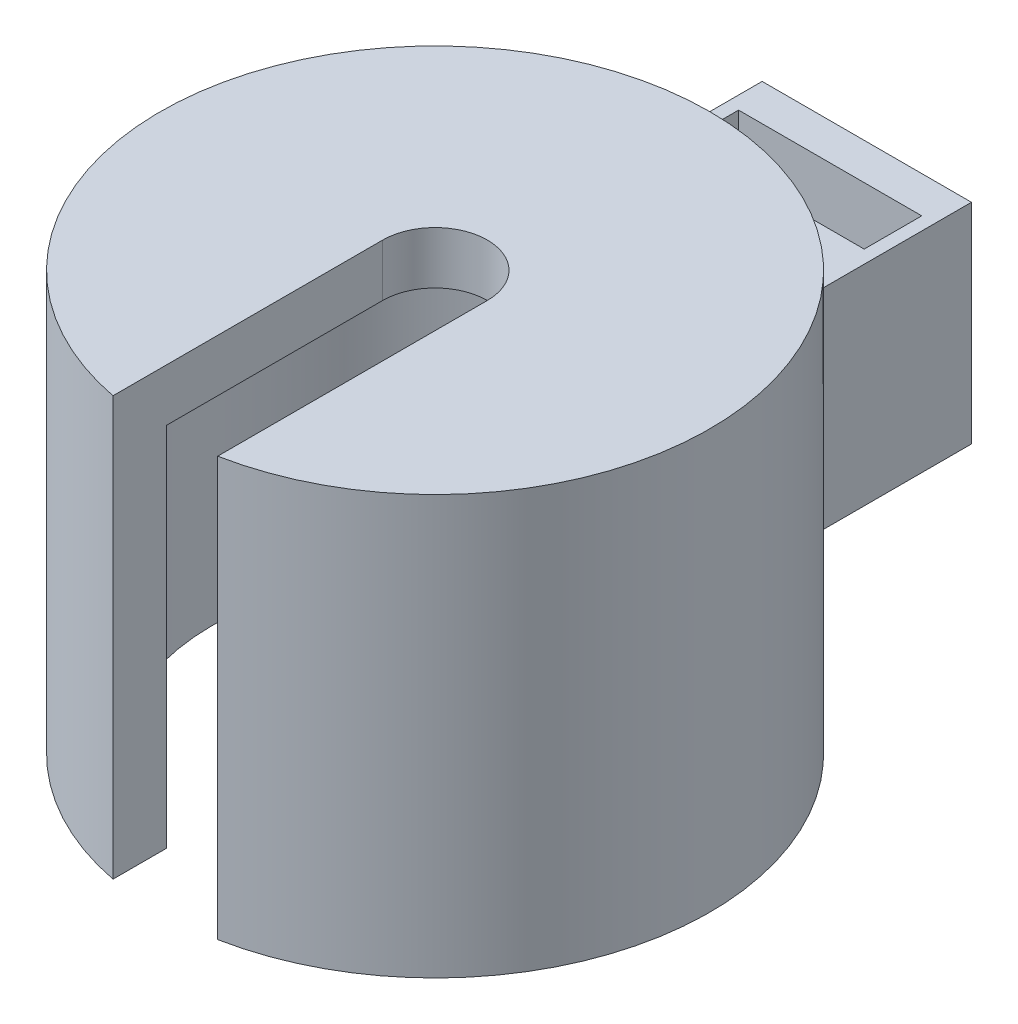
ISO-10303-21;
HEADER;
FILE_DESCRIPTION(('STEP AP214'),'2;1');
FILE_NAME('part.step','',(''),(''),'','','');
FILE_SCHEMA(('AUTOMOTIVE_DESIGN { 1 0 10303 214 1 1 1 1 }'));
ENDSEC;
DATA;
#1=APPLICATION_CONTEXT('core data for automotive mechanical design processes');
#2=APPLICATION_PROTOCOL_DEFINITION('international standard','automotive_design',2000,#1);
#3=PRODUCT_CONTEXT('',#1,'mechanical');
#4=PRODUCT('Part','Part','',(#3));
#5=PRODUCT_RELATED_PRODUCT_CATEGORY('part','',(#4));
#6=PRODUCT_DEFINITION_FORMATION('','',#4);
#7=PRODUCT_DEFINITION_CONTEXT('part definition',#1,'design');
#8=PRODUCT_DEFINITION('design','',#6,#7);
#9=PRODUCT_DEFINITION_SHAPE('','',#8);
#10=(LENGTH_UNIT() NAMED_UNIT(*) SI_UNIT(.MILLI.,.METRE.));
#11=(NAMED_UNIT(*) PLANE_ANGLE_UNIT() SI_UNIT($,.RADIAN.));
#12=(NAMED_UNIT(*) SI_UNIT($,.STERADIAN.) SOLID_ANGLE_UNIT());
#13=UNCERTAINTY_MEASURE_WITH_UNIT(LENGTH_MEASURE(1.E-05),#10,'distance_accuracy_value','');
#14=(GEOMETRIC_REPRESENTATION_CONTEXT(3) GLOBAL_UNCERTAINTY_ASSIGNED_CONTEXT((#13)) GLOBAL_UNIT_ASSIGNED_CONTEXT((#10,
#11,#12)) REPRESENTATION_CONTEXT('',''));
#15=CARTESIAN_POINT('',(0.,0.,0.));
#16=DIRECTION('',(0.,0.,1.));
#17=DIRECTION('',(1.,0.,0.));
#18=AXIS2_PLACEMENT_3D('',#15,#16,#17);
#19=CARTESIAN_POINT('',(0.,7.,0.));
#20=DIRECTION('',(0.,-1.,0.));
#21=DIRECTION('',(0.,0.,-1.));
#22=AXIS2_PLACEMENT_3D('',#19,#20,#21);
#23=CYLINDRICAL_SURFACE('',#22,5.25);
#24=CARTESIAN_POINT('',(0.,0.,0.));
#25=DIRECTION('',(0.,1.,0.));
#26=DIRECTION('',(0.,0.,1.));
#27=AXIS2_PLACEMENT_3D('',#24,#25,#26);
#28=CIRCLE('',#27,5.25);
#29=CARTESIAN_POINT('',(1.,0.,5.15388203202208));
#30=VERTEX_POINT('',#29);
#31=CARTESIAN_POINT('',(-1.,0.,5.15388203202208));
#32=VERTEX_POINT('',#31);
#33=EDGE_CURVE('E266',#30,#32,#28,.T.);
#34=ORIENTED_EDGE('',*,*,#33,.T.);
#35=DIRECTION('',(0.,-1.,0.));
#36=VECTOR('',#35,1.);
#37=CARTESIAN_POINT('',(-1.,7.,5.15388203202208));
#38=LINE('',#37,#36);
#39=CARTESIAN_POINT('',(-1.,8.,5.15388203202208));
#40=VERTEX_POINT('',#39);
#41=EDGE_CURVE('E282',#40,#32,#38,.T.);
#42=ORIENTED_EDGE('',*,*,#41,.F.);
#43=CARTESIAN_POINT('',(0.,8.,0.));
#44=DIRECTION('',(0.,1.,0.));
#45=DIRECTION('',(0.,0.,1.));
#46=AXIS2_PLACEMENT_3D('',#43,#44,#45);
#47=CIRCLE('',#46,5.25);
#48=CARTESIAN_POINT('',(1.,8.,5.15388203202208));
#49=VERTEX_POINT('',#48);
#50=EDGE_CURVE('E233',#49,#40,#47,.T.);
#51=ORIENTED_EDGE('',*,*,#50,.F.);
#52=DIRECTION('',(0.,-1.,0.));
#53=VECTOR('',#52,1.);
#54=CARTESIAN_POINT('',(1.,7.,5.15388203202208));
#55=LINE('',#54,#53);
#56=EDGE_CURVE('E285',#49,#30,#55,.T.);
#57=ORIENTED_EDGE('',*,*,#56,.T.);
#58=EDGE_LOOP('',(#34,#42,#51,#57));
#59=FACE_BOUND('',#58,.T.);
#60=DIRECTION('',(0.,-1.,0.));
#61=VECTOR('',#60,1.);
#62=CARTESIAN_POINT('',(-2.,7.,-4.8541219597369));
#63=LINE('',#62,#61);
#64=CARTESIAN_POINT('',(-2.,2.,-4.8541219597369));
#65=VERTEX_POINT('',#64);
#66=CARTESIAN_POINT('',(-2.,6.,-4.8541219597369));
#67=VERTEX_POINT('',#66);
#68=EDGE_CURVE('E11',#65,#67,#63,.F.);
#69=ORIENTED_EDGE('',*,*,#68,.F.);
#70=CARTESIAN_POINT('',(0.,2.,0.));
#71=DIRECTION('',(0.,-1.,0.));
#72=DIRECTION('',(0.,0.,-1.));
#73=AXIS2_PLACEMENT_3D('',#70,#71,#72);
#74=CIRCLE('',#73,5.25);
#75=CARTESIAN_POINT('',(2.,2.,-4.8541219597369));
#76=VERTEX_POINT('',#75);
#77=EDGE_CURVE('E219',#65,#76,#74,.T.);
#78=ORIENTED_EDGE('',*,*,#77,.T.);
#79=DIRECTION('',(0.,-1.,0.));
#80=VECTOR('',#79,1.);
#81=CARTESIAN_POINT('',(2.,7.,-4.8541219597369));
#82=LINE('',#81,#80);
#83=CARTESIAN_POINT('',(2.,6.,-4.8541219597369));
#84=VERTEX_POINT('',#83);
#85=EDGE_CURVE('E48',#76,#84,#82,.F.);
#86=ORIENTED_EDGE('',*,*,#85,.T.);
#87=CARTESIAN_POINT('',(0.,6.,0.));
#88=DIRECTION('',(0.,-1.,0.));
#89=DIRECTION('',(0.,0.,-1.));
#90=AXIS2_PLACEMENT_3D('',#87,#88,#89);
#91=CIRCLE('',#90,5.25);
#92=EDGE_CURVE('E212',#67,#84,#91,.T.);
#93=ORIENTED_EDGE('',*,*,#92,.F.);
#94=EDGE_LOOP('',(#69,#78,#86,#93));
#95=FACE_BOUND('',#94,.T.);
#96=ADVANCED_FACE('F39',(#59,#95),#23,.T.);
#97=CARTESIAN_POINT('',(1.,7.,0.));
#98=DIRECTION('',(1.,0.,0.));
#99=DIRECTION('',(0.,0.,-1.));
#100=AXIS2_PLACEMENT_3D('',#97,#98,#99);
#101=PLANE('',#100);
#102=DIRECTION('',(0.,0.,1.));
#103=VECTOR('',#102,1.);
#104=CARTESIAN_POINT('',(1.,0.,0.));
#105=LINE('',#104,#103);
#106=CARTESIAN_POINT('',(1.,0.,4.13067791046458));
#107=VERTEX_POINT('',#106);
#108=EDGE_CURVE('E256',#107,#30,#105,.T.);
#109=ORIENTED_EDGE('',*,*,#108,.T.);
#110=ORIENTED_EDGE('',*,*,#56,.F.);
#111=DIRECTION('',(0.,0.,1.));
#112=VECTOR('',#111,1.);
#113=CARTESIAN_POINT('',(1.,8.,0.));
#114=LINE('',#113,#112);
#115=CARTESIAN_POINT('',(1.,8.,0.));
#116=VERTEX_POINT('',#115);
#117=EDGE_CURVE('E228',#116,#49,#114,.T.);
#118=ORIENTED_EDGE('',*,*,#117,.F.);
#119=DIRECTION('',(0.,-1.,0.));
#120=VECTOR('',#119,1.);
#121=CARTESIAN_POINT('',(1.,8.,0.));
#122=LINE('',#121,#120);
#123=CARTESIAN_POINT('',(1.,7.,0.));
#124=VERTEX_POINT('',#123);
#125=EDGE_CURVE('E253',#116,#124,#122,.T.);
#126=ORIENTED_EDGE('',*,*,#125,.T.);
#127=DIRECTION('',(0.,0.,1.));
#128=VECTOR('',#127,1.);
#129=CARTESIAN_POINT('',(1.,7.,0.));
#130=LINE('',#129,#128);
#131=CARTESIAN_POINT('',(1.,7.,4.13067791046458));
#132=VERTEX_POINT('',#131);
#133=EDGE_CURVE('E245',#124,#132,#130,.T.);
#134=ORIENTED_EDGE('',*,*,#133,.T.);
#135=DIRECTION('',(0.,-1.,0.));
#136=VECTOR('',#135,1.);
#137=CARTESIAN_POINT('',(1.,7.,4.13067791046458));
#138=LINE('',#137,#136);
#139=EDGE_CURVE('E261',#132,#107,#138,.T.);
#140=ORIENTED_EDGE('',*,*,#139,.T.);
#141=EDGE_LOOP('',(#109,#110,#118,#126,#134,#140));
#142=FACE_BOUND('',#141,.T.);
#143=ADVANCED_FACE('F41',(#142),#101,.F.);
#144=CARTESIAN_POINT('',(-1.,7.,0.));
#145=DIRECTION('',(1.,0.,0.));
#146=DIRECTION('',(0.,0.,-1.));
#147=AXIS2_PLACEMENT_3D('',#144,#145,#146);
#148=PLANE('',#147);
#149=DIRECTION('',(0.,0.,1.));
#150=VECTOR('',#149,1.);
#151=CARTESIAN_POINT('',(-1.,0.,0.));
#152=LINE('',#151,#150);
#153=CARTESIAN_POINT('',(-1.,0.,4.13067791046458));
#154=VERTEX_POINT('',#153);
#155=EDGE_CURVE('E270',#154,#32,#152,.T.);
#156=ORIENTED_EDGE('',*,*,#155,.F.);
#157=DIRECTION('',(0.,-1.,0.));
#158=VECTOR('',#157,1.);
#159=CARTESIAN_POINT('',(-1.,7.,4.13067791046458));
#160=LINE('',#159,#158);
#161=CARTESIAN_POINT('',(-1.,7.,4.13067791046458));
#162=VERTEX_POINT('',#161);
#163=EDGE_CURVE('E279',#162,#154,#160,.T.);
#164=ORIENTED_EDGE('',*,*,#163,.F.);
#165=DIRECTION('',(0.,0.,1.));
#166=VECTOR('',#165,1.);
#167=CARTESIAN_POINT('',(-1.,7.,0.));
#168=LINE('',#167,#166);
#169=CARTESIAN_POINT('',(-1.,7.,0.));
#170=VERTEX_POINT('',#169);
#171=EDGE_CURVE('E229',#170,#162,#168,.T.);
#172=ORIENTED_EDGE('',*,*,#171,.F.);
#173=DIRECTION('',(0.,-1.,0.));
#174=VECTOR('',#173,1.);
#175=CARTESIAN_POINT('',(-1.,8.,0.));
#176=LINE('',#175,#174);
#177=CARTESIAN_POINT('',(-1.,8.,0.));
#178=VERTEX_POINT('',#177);
#179=EDGE_CURVE('E241',#178,#170,#176,.T.);
#180=ORIENTED_EDGE('',*,*,#179,.F.);
#181=DIRECTION('',(0.,0.,1.));
#182=VECTOR('',#181,1.);
#183=CARTESIAN_POINT('',(-1.,8.,0.));
#184=LINE('',#183,#182);
#185=EDGE_CURVE('E237',#178,#40,#184,.T.);
#186=ORIENTED_EDGE('',*,*,#185,.T.);
#187=ORIENTED_EDGE('',*,*,#41,.T.);
#188=EDGE_LOOP('',(#156,#164,#172,#180,#186,#187));
#189=FACE_BOUND('',#188,.T.);
#190=ADVANCED_FACE('F325',(#189),#148,.T.);
#191=CARTESIAN_POINT('',(0.,7.,0.));
#192=DIRECTION('',(0.,-1.,0.));
#193=DIRECTION('',(0.,0.,-1.));
#194=AXIS2_PLACEMENT_3D('',#191,#192,#193);
#195=CYLINDRICAL_SURFACE('',#194,4.25);
#196=CARTESIAN_POINT('',(0.,0.,0.));
#197=DIRECTION('',(0.,1.,0.));
#198=DIRECTION('',(0.,0.,1.));
#199=AXIS2_PLACEMENT_3D('',#196,#197,#198);
#200=CIRCLE('',#199,4.25);
#201=EDGE_CURVE('E262',#107,#154,#200,.T.);
#202=ORIENTED_EDGE('',*,*,#201,.F.);
#203=ORIENTED_EDGE('',*,*,#139,.F.);
#204=CARTESIAN_POINT('',(0.,7.,0.));
#205=DIRECTION('',(0.,1.,0.));
#206=DIRECTION('',(0.,0.,1.));
#207=AXIS2_PLACEMENT_3D('',#204,#205,#206);
#208=CIRCLE('',#207,4.25);
#209=EDGE_CURVE('E257',#132,#162,#208,.T.);
#210=ORIENTED_EDGE('',*,*,#209,.T.);
#211=ORIENTED_EDGE('',*,*,#163,.T.);
#212=EDGE_LOOP('',(#202,#203,#210,#211));
#213=FACE_BOUND('',#212,.T.);
#214=ADVANCED_FACE('F330',(#213),#195,.F.);
#215=CARTESIAN_POINT('',(0.,0.,0.));
#216=DIRECTION('',(0.,1.,0.));
#217=DIRECTION('',(0.,0.,1.));
#218=AXIS2_PLACEMENT_3D('',#215,#216,#217);
#219=PLANE('',#218);
#220=ORIENTED_EDGE('',*,*,#108,.F.);
#221=ORIENTED_EDGE('',*,*,#201,.T.);
#222=ORIENTED_EDGE('',*,*,#155,.T.);
#223=ORIENTED_EDGE('',*,*,#33,.F.);
#224=EDGE_LOOP('',(#220,#221,#222,#223));
#225=FACE_BOUND('',#224,.T.);
#226=ADVANCED_FACE('F334',(#225),#219,.F.);
#227=CARTESIAN_POINT('',(0.,7.,0.));
#228=DIRECTION('',(0.,1.,0.));
#229=DIRECTION('',(0.,0.,1.));
#230=AXIS2_PLACEMENT_3D('',#227,#228,#229);
#231=PLANE('',#230);
#232=ORIENTED_EDGE('',*,*,#209,.F.);
#233=ORIENTED_EDGE('',*,*,#133,.F.);
#234=CARTESIAN_POINT('',(0.,7.,0.));
#235=DIRECTION('',(0.,1.,0.));
#236=DIRECTION('',(0.,0.,1.));
#237=AXIS2_PLACEMENT_3D('',#234,#235,#236);
#238=CIRCLE('',#237,1.);
#239=EDGE_CURVE('E223',#124,#170,#238,.T.);
#240=ORIENTED_EDGE('',*,*,#239,.T.);
#241=ORIENTED_EDGE('',*,*,#171,.T.);
#242=EDGE_LOOP('',(#232,#233,#240,#241));
#243=FACE_BOUND('',#242,.T.);
#244=ADVANCED_FACE('F338',(#243),#231,.F.);
#245=CARTESIAN_POINT('',(0.,8.,0.));
#246=DIRECTION('',(0.,-1.,0.));
#247=DIRECTION('',(0.,0.,-1.));
#248=AXIS2_PLACEMENT_3D('',#245,#246,#247);
#249=CYLINDRICAL_SURFACE('',#248,1.);
#250=ORIENTED_EDGE('',*,*,#239,.F.);
#251=ORIENTED_EDGE('',*,*,#125,.F.);
#252=CARTESIAN_POINT('',(0.,8.,0.));
#253=DIRECTION('',(0.,1.,0.));
#254=DIRECTION('',(0.,0.,1.));
#255=AXIS2_PLACEMENT_3D('',#252,#253,#254);
#256=CIRCLE('',#255,1.);
#257=EDGE_CURVE('E224',#116,#178,#256,.T.);
#258=ORIENTED_EDGE('',*,*,#257,.T.);
#259=ORIENTED_EDGE('',*,*,#179,.T.);
#260=EDGE_LOOP('',(#250,#251,#258,#259));
#261=FACE_BOUND('',#260,.T.);
#262=ADVANCED_FACE('F316',(#261),#249,.F.);
#263=CARTESIAN_POINT('',(0.,8.,0.));
#264=DIRECTION('',(0.,1.,0.));
#265=DIRECTION('',(0.,0.,1.));
#266=AXIS2_PLACEMENT_3D('',#263,#264,#265);
#267=PLANE('',#266);
#268=ORIENTED_EDGE('',*,*,#257,.F.);
#269=ORIENTED_EDGE('',*,*,#117,.T.);
#270=ORIENTED_EDGE('',*,*,#50,.T.);
#271=ORIENTED_EDGE('',*,*,#185,.F.);
#272=EDGE_LOOP('',(#268,#269,#270,#271));
#273=FACE_BOUND('',#272,.T.);
#274=ADVANCED_FACE('F309',(#273),#267,.T.);
#275=CARTESIAN_POINT('',(-2.,0.,0.));
#276=DIRECTION('',(1.,0.,0.));
#277=DIRECTION('',(0.,0.,-1.));
#278=AXIS2_PLACEMENT_3D('',#275,#276,#277);
#279=PLANE('',#278);
#280=DIRECTION('',(0.,0.,-1.));
#281=VECTOR('',#280,1.);
#282=CARTESIAN_POINT('',(-2.,2.,0.));
#283=LINE('',#282,#281);
#284=CARTESIAN_POINT('',(-2.,2.,-8.25));
#285=VERTEX_POINT('',#284);
#286=EDGE_CURVE('E204',#65,#285,#283,.T.);
#287=ORIENTED_EDGE('',*,*,#286,.F.);
#288=ORIENTED_EDGE('',*,*,#68,.T.);
#289=DIRECTION('',(0.,0.,-1.));
#290=VECTOR('',#289,1.);
#291=CARTESIAN_POINT('',(-2.,6.,0.));
#292=LINE('',#291,#290);
#293=CARTESIAN_POINT('',(-2.,6.,-8.25));
#294=VERTEX_POINT('',#293);
#295=EDGE_CURVE('E201',#67,#294,#292,.T.);
#296=ORIENTED_EDGE('',*,*,#295,.T.);
#297=DIRECTION('',(0.,-1.,0.));
#298=VECTOR('',#297,1.);
#299=CARTESIAN_POINT('',(-2.,0.,-8.25));
#300=LINE('',#299,#298);
#301=EDGE_CURVE('E197',#294,#285,#300,.T.);
#302=ORIENTED_EDGE('',*,*,#301,.T.);
#303=EDGE_LOOP('',(#287,#288,#296,#302));
#304=FACE_BOUND('',#303,.T.);
#305=ADVANCED_FACE('F307',(#304),#279,.F.);
#306=CARTESIAN_POINT('',(2.,0.,0.));
#307=DIRECTION('',(1.,0.,0.));
#308=DIRECTION('',(0.,0.,-1.));
#309=AXIS2_PLACEMENT_3D('',#306,#307,#308);
#310=PLANE('',#309);
#311=ORIENTED_EDGE('',*,*,#85,.F.);
#312=DIRECTION('',(0.,0.,-1.));
#313=VECTOR('',#312,1.);
#314=CARTESIAN_POINT('',(2.,2.,0.));
#315=LINE('',#314,#313);
#316=CARTESIAN_POINT('',(2.,2.,-8.25));
#317=VERTEX_POINT('',#316);
#318=EDGE_CURVE('E194',#76,#317,#315,.T.);
#319=ORIENTED_EDGE('',*,*,#318,.T.);
#320=DIRECTION('',(0.,-1.,0.));
#321=VECTOR('',#320,1.);
#322=CARTESIAN_POINT('',(2.,0.,-8.25));
#323=LINE('',#322,#321);
#324=CARTESIAN_POINT('',(2.,6.,-8.25));
#325=VERTEX_POINT('',#324);
#326=EDGE_CURVE('E187',#325,#317,#323,.T.);
#327=ORIENTED_EDGE('',*,*,#326,.F.);
#328=DIRECTION('',(0.,0.,-1.));
#329=VECTOR('',#328,1.);
#330=CARTESIAN_POINT('',(2.,6.,0.));
#331=LINE('',#330,#329);
#332=EDGE_CURVE('E191',#84,#325,#331,.T.);
#333=ORIENTED_EDGE('',*,*,#332,.F.);
#334=EDGE_LOOP('',(#311,#319,#327,#333));
#335=FACE_BOUND('',#334,.T.);
#336=ADVANCED_FACE('F295',(#335),#310,.T.);
#337=CARTESIAN_POINT('',(-2.,0.,-8.25));
#338=DIRECTION('',(0.,0.,1.));
#339=DIRECTION('',(1.,0.,0.));
#340=AXIS2_PLACEMENT_3D('',#337,#338,#339);
#341=PLANE('',#340);
#342=DIRECTION('',(1.,0.,0.));
#343=VECTOR('',#342,1.);
#344=CARTESIAN_POINT('',(-2.,6.,-8.25));
#345=LINE('',#344,#343);
#346=EDGE_CURVE('E207',#294,#325,#345,.T.);
#347=ORIENTED_EDGE('',*,*,#346,.T.);
#348=ORIENTED_EDGE('',*,*,#326,.T.);
#349=DIRECTION('',(1.,0.,0.));
#350=VECTOR('',#349,1.);
#351=CARTESIAN_POINT('',(-2.,2.,-8.25));
#352=LINE('',#351,#350);
#353=EDGE_CURVE('E208',#285,#317,#352,.T.);
#354=ORIENTED_EDGE('',*,*,#353,.F.);
#355=ORIENTED_EDGE('',*,*,#301,.F.);
#356=EDGE_LOOP('',(#347,#348,#354,#355));
#357=FACE_BOUND('',#356,.T.);
#358=ADVANCED_FACE('F303',(#357),#341,.F.);
#359=CARTESIAN_POINT('',(-2.,2.,0.));
#360=DIRECTION('',(0.,-1.,0.));
#361=DIRECTION('',(0.,0.,-1.));
#362=AXIS2_PLACEMENT_3D('',#359,#360,#361);
#363=PLANE('',#362);
#364=DIRECTION('',(1.,0.,0.));
#365=VECTOR('',#364,1.);
#366=CARTESIAN_POINT('',(-2.,2.,-7.55));
#367=LINE('',#366,#365);
#368=CARTESIAN_POINT('',(-1.75,2.,-7.55));
#369=VERTEX_POINT('',#368);
#370=CARTESIAN_POINT('',(1.75,2.,-7.55));
#371=VERTEX_POINT('',#370);
#372=EDGE_CURVE('E184',#369,#371,#367,.T.);
#373=ORIENTED_EDGE('',*,*,#372,.F.);
#374=DIRECTION('',(0.,0.,-1.));
#375=VECTOR('',#374,1.);
#376=CARTESIAN_POINT('',(-1.75,2.,0.));
#377=LINE('',#376,#375);
#378=CARTESIAN_POINT('',(-1.75,2.,-6.45));
#379=VERTEX_POINT('',#378);
#380=EDGE_CURVE('E171',#379,#369,#377,.T.);
#381=ORIENTED_EDGE('',*,*,#380,.F.);
#382=DIRECTION('',(1.,0.,0.));
#383=VECTOR('',#382,1.);
#384=CARTESIAN_POINT('',(-2.,2.,-6.45));
#385=LINE('',#384,#383);
#386=CARTESIAN_POINT('',(1.75,2.,-6.45));
#387=VERTEX_POINT('',#386);
#388=EDGE_CURVE('E146',#379,#387,#385,.T.);
#389=ORIENTED_EDGE('',*,*,#388,.T.);
#390=DIRECTION('',(0.,0.,-1.));
#391=VECTOR('',#390,1.);
#392=CARTESIAN_POINT('',(1.75,2.,0.));
#393=LINE('',#392,#391);
#394=EDGE_CURVE('E180',#387,#371,#393,.T.);
#395=ORIENTED_EDGE('',*,*,#394,.T.);
#396=EDGE_LOOP('',(#373,#381,#389,#395));
#397=FACE_BOUND('',#396,.T.);
#398=ORIENTED_EDGE('',*,*,#77,.F.);
#399=ORIENTED_EDGE('',*,*,#286,.T.);
#400=ORIENTED_EDGE('',*,*,#353,.T.);
#401=ORIENTED_EDGE('',*,*,#318,.F.);
#402=EDGE_LOOP('',(#398,#399,#400,#401));
#403=FACE_BOUND('',#402,.T.);
#404=ADVANCED_FACE('F298',(#397,#403),#363,.T.);
#405=CARTESIAN_POINT('',(-2.,6.,0.));
#406=DIRECTION('',(0.,-1.,0.));
#407=DIRECTION('',(0.,0.,-1.));
#408=AXIS2_PLACEMENT_3D('',#405,#406,#407);
#409=PLANE('',#408);
#410=DIRECTION('',(0.,0.,1.));
#411=VECTOR('',#410,1.);
#412=CARTESIAN_POINT('',(-1.75,6.,0.));
#413=LINE('',#412,#411);
#414=CARTESIAN_POINT('',(-1.75,6.,-7.55));
#415=VERTEX_POINT('',#414);
#416=CARTESIAN_POINT('',(-1.75,6.,-6.45));
#417=VERTEX_POINT('',#416);
#418=EDGE_CURVE('E153',#415,#417,#413,.T.);
#419=ORIENTED_EDGE('',*,*,#418,.F.);
#420=DIRECTION('',(-1.,0.,0.));
#421=VECTOR('',#420,1.);
#422=CARTESIAN_POINT('',(0.,6.,-7.55));
#423=LINE('',#422,#421);
#424=CARTESIAN_POINT('',(1.75,6.,-7.55));
#425=VERTEX_POINT('',#424);
#426=EDGE_CURVE('E63',#425,#415,#423,.T.);
#427=ORIENTED_EDGE('',*,*,#426,.F.);
#428=DIRECTION('',(0.,0.,1.));
#429=VECTOR('',#428,1.);
#430=CARTESIAN_POINT('',(1.75,6.,0.));
#431=LINE('',#430,#429);
#432=CARTESIAN_POINT('',(1.75,6.,-6.45));
#433=VERTEX_POINT('',#432);
#434=EDGE_CURVE('E161',#425,#433,#431,.T.);
#435=ORIENTED_EDGE('',*,*,#434,.T.);
#436=DIRECTION('',(-1.,0.,0.));
#437=VECTOR('',#436,1.);
#438=CARTESIAN_POINT('',(0.,6.,-6.45));
#439=LINE('',#438,#437);
#440=EDGE_CURVE('E143',#433,#417,#439,.T.);
#441=ORIENTED_EDGE('',*,*,#440,.T.);
#442=EDGE_LOOP('',(#419,#427,#435,#441));
#443=FACE_BOUND('',#442,.T.);
#444=ORIENTED_EDGE('',*,*,#295,.F.);
#445=ORIENTED_EDGE('',*,*,#92,.T.);
#446=ORIENTED_EDGE('',*,*,#332,.T.);
#447=ORIENTED_EDGE('',*,*,#346,.F.);
#448=EDGE_LOOP('',(#444,#445,#446,#447));
#449=FACE_BOUND('',#448,.T.);
#450=ADVANCED_FACE('F158',(#443,#449),#409,.F.);
#451=CARTESIAN_POINT('',(0.,1.,-7.55));
#452=DIRECTION('',(0.,0.,-1.));
#453=DIRECTION('',(-1.,0.,0.));
#454=AXIS2_PLACEMENT_3D('',#451,#452,#453);
#455=PLANE('',#454);
#456=ORIENTED_EDGE('',*,*,#372,.T.);
#457=DIRECTION('',(0.,1.,0.));
#458=VECTOR('',#457,1.);
#459=CARTESIAN_POINT('',(1.75,1.,-7.55));
#460=LINE('',#459,#458);
#461=EDGE_CURVE('E168',#371,#425,#460,.T.);
#462=ORIENTED_EDGE('',*,*,#461,.T.);
#463=ORIENTED_EDGE('',*,*,#426,.T.);
#464=DIRECTION('',(0.,1.,0.));
#465=VECTOR('',#464,1.);
#466=CARTESIAN_POINT('',(-1.75,1.,-7.55));
#467=LINE('',#466,#465);
#468=EDGE_CURVE('E150',#369,#415,#467,.T.);
#469=ORIENTED_EDGE('',*,*,#468,.F.);
#470=EDGE_LOOP('',(#456,#462,#463,#469));
#471=FACE_BOUND('',#470,.T.);
#472=ADVANCED_FACE('F349',(#471),#455,.F.);
#473=CARTESIAN_POINT('',(1.75,1.,0.));
#474=DIRECTION('',(-1.,0.,0.));
#475=DIRECTION('',(0.,0.,1.));
#476=AXIS2_PLACEMENT_3D('',#473,#474,#475);
#477=PLANE('',#476);
#478=DIRECTION('',(0.,1.,0.));
#479=VECTOR('',#478,1.);
#480=CARTESIAN_POINT('',(1.75,1.,-6.45));
#481=LINE('',#480,#479);
#482=EDGE_CURVE('E149',#387,#433,#481,.T.);
#483=ORIENTED_EDGE('',*,*,#482,.T.);
#484=ORIENTED_EDGE('',*,*,#434,.F.);
#485=ORIENTED_EDGE('',*,*,#461,.F.);
#486=ORIENTED_EDGE('',*,*,#394,.F.);
#487=EDGE_LOOP('',(#483,#484,#485,#486));
#488=FACE_BOUND('',#487,.T.);
#489=ADVANCED_FACE('F357',(#488),#477,.T.);
#490=CARTESIAN_POINT('',(0.,1.,-6.45));
#491=DIRECTION('',(0.,0.,-1.));
#492=DIRECTION('',(-1.,0.,0.));
#493=AXIS2_PLACEMENT_3D('',#490,#491,#492);
#494=PLANE('',#493);
#495=DIRECTION('',(0.,1.,0.));
#496=VECTOR('',#495,1.);
#497=CARTESIAN_POINT('',(-1.75,1.,-6.45));
#498=LINE('',#497,#496);
#499=EDGE_CURVE('E55',#379,#417,#498,.T.);
#500=ORIENTED_EDGE('',*,*,#499,.T.);
#501=ORIENTED_EDGE('',*,*,#440,.F.);
#502=ORIENTED_EDGE('',*,*,#482,.F.);
#503=ORIENTED_EDGE('',*,*,#388,.F.);
#504=EDGE_LOOP('',(#500,#501,#502,#503));
#505=FACE_BOUND('',#504,.T.);
#506=ADVANCED_FACE('F140',(#505),#494,.T.);
#507=CARTESIAN_POINT('',(-1.75,1.,0.));
#508=DIRECTION('',(-1.,0.,0.));
#509=DIRECTION('',(0.,0.,1.));
#510=AXIS2_PLACEMENT_3D('',#507,#508,#509);
#511=PLANE('',#510);
#512=ORIENTED_EDGE('',*,*,#380,.T.);
#513=ORIENTED_EDGE('',*,*,#468,.T.);
#514=ORIENTED_EDGE('',*,*,#418,.T.);
#515=ORIENTED_EDGE('',*,*,#499,.F.);
#516=EDGE_LOOP('',(#512,#513,#514,#515));
#517=FACE_BOUND('',#516,.T.);
#518=ADVANCED_FACE('F154',(#517),#511,.F.);
#519=CLOSED_SHELL('',(#96,#143,#190,#214,#226,#244,#262,#274,#305,#336,#358,#404,#450,#472,#489,
#506,#518));
#520=MANIFOLD_SOLID_BREP('B2',#519);
#521=ADVANCED_BREP_SHAPE_REPRESENTATION('',(#18,#520),#14);
#522=SHAPE_DEFINITION_REPRESENTATION(#9,#521);
ENDSEC;
END-ISO-10303-21;
